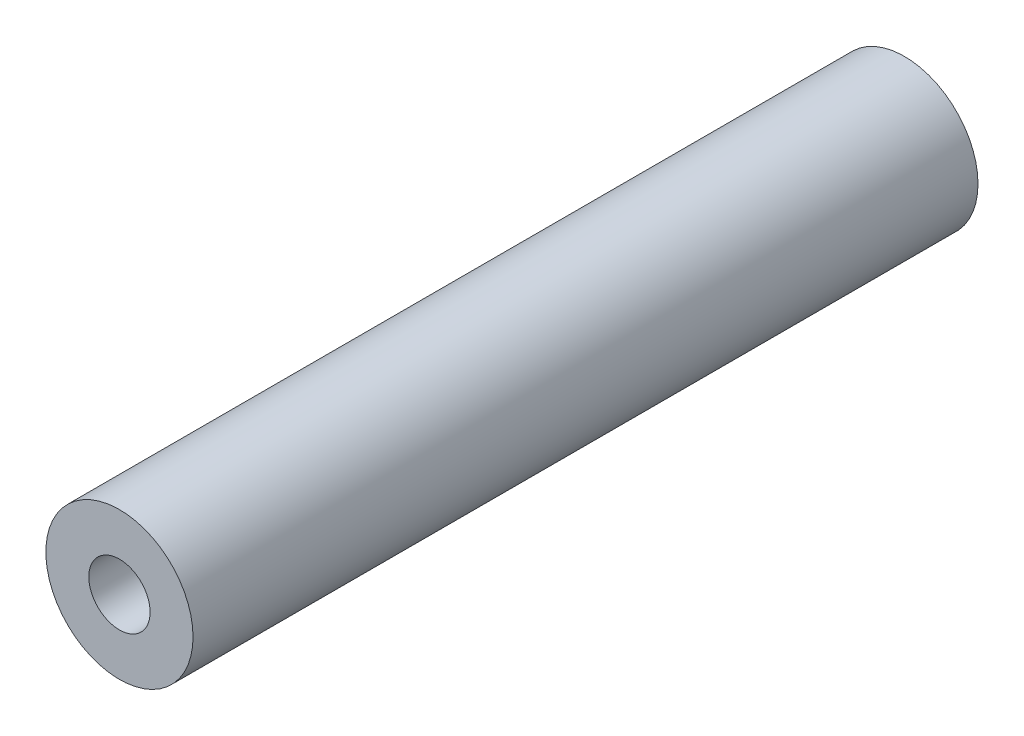
ISO-10303-21;
HEADER;
FILE_DESCRIPTION(('STEP AP214'),'2;1');
FILE_NAME('part.step','',(''),(''),'','','');
FILE_SCHEMA(('AUTOMOTIVE_DESIGN { 1 0 10303 214 1 1 1 1 }'));
ENDSEC;
DATA;
#1=APPLICATION_CONTEXT('core data for automotive mechanical design processes');
#2=APPLICATION_PROTOCOL_DEFINITION('international standard','automotive_design',2000,#1);
#3=PRODUCT_CONTEXT('',#1,'mechanical');
#4=PRODUCT('Part','Part','',(#3));
#5=PRODUCT_RELATED_PRODUCT_CATEGORY('part','',(#4));
#6=PRODUCT_DEFINITION_FORMATION('','',#4);
#7=PRODUCT_DEFINITION_CONTEXT('part definition',#1,'design');
#8=PRODUCT_DEFINITION('design','',#6,#7);
#9=PRODUCT_DEFINITION_SHAPE('','',#8);
#10=(LENGTH_UNIT() NAMED_UNIT(*) SI_UNIT(.MILLI.,.METRE.));
#11=(NAMED_UNIT(*) PLANE_ANGLE_UNIT() SI_UNIT($,.RADIAN.));
#12=(NAMED_UNIT(*) SI_UNIT($,.STERADIAN.) SOLID_ANGLE_UNIT());
#13=UNCERTAINTY_MEASURE_WITH_UNIT(LENGTH_MEASURE(1.E-05),#10,'distance_accuracy_value','');
#14=(GEOMETRIC_REPRESENTATION_CONTEXT(3) GLOBAL_UNCERTAINTY_ASSIGNED_CONTEXT((#13)) GLOBAL_UNIT_ASSIGNED_CONTEXT((#10,
#11,#12)) REPRESENTATION_CONTEXT('',''));
#15=CARTESIAN_POINT('',(0.,0.,0.));
#16=DIRECTION('',(0.,0.,1.));
#17=DIRECTION('',(1.,0.,0.));
#18=AXIS2_PLACEMENT_3D('',#15,#16,#17);
#19=CARTESIAN_POINT('',(0.,0.,32.));
#20=DIRECTION('',(0.,0.,-1.));
#21=DIRECTION('',(-1.,0.,0.));
#22=AXIS2_PLACEMENT_3D('',#19,#20,#21);
#23=CYLINDRICAL_SURFACE('',#22,3.);
#24=CARTESIAN_POINT('',(0.,0.,32.));
#25=DIRECTION('',(0.,0.,1.));
#26=DIRECTION('',(1.,0.,0.));
#27=AXIS2_PLACEMENT_3D('',#24,#25,#26);
#28=CIRCLE('',#27,3.);
#29=CARTESIAN_POINT('',(3.,0.,32.));
#30=VERTEX_POINT('',#29);
#31=EDGE_CURVE('E10',#30,#30,#28,.T.);
#32=ORIENTED_EDGE('',*,*,#31,.F.);
#33=EDGE_LOOP('',(#32));
#34=FACE_BOUND('',#33,.T.);
#35=CARTESIAN_POINT('',(0.,0.,0.));
#36=DIRECTION('',(0.,0.,1.));
#37=DIRECTION('',(1.,0.,0.));
#38=AXIS2_PLACEMENT_3D('',#35,#36,#37);
#39=CIRCLE('',#38,3.);
#40=CARTESIAN_POINT('',(3.,0.,0.));
#41=VERTEX_POINT('',#40);
#42=EDGE_CURVE('E45',#41,#41,#39,.T.);
#43=ORIENTED_EDGE('',*,*,#42,.T.);
#44=EDGE_LOOP('',(#43));
#45=FACE_BOUND('',#44,.T.);
#46=ADVANCED_FACE('F42',(#34,#45),#23,.T.);
#47=CARTESIAN_POINT('',(0.,0.,32.));
#48=DIRECTION('',(0.,0.,1.));
#49=DIRECTION('',(1.,0.,0.));
#50=AXIS2_PLACEMENT_3D('',#47,#48,#49);
#51=PLANE('',#50);
#52=CARTESIAN_POINT('',(0.,0.,32.));
#53=DIRECTION('',(0.,0.,1.));
#54=DIRECTION('',(1.,0.,0.));
#55=AXIS2_PLACEMENT_3D('',#52,#53,#54);
#56=CIRCLE('',#55,1.24999999999999);
#57=CARTESIAN_POINT('',(1.24999999999999,0.,32.));
#58=VERTEX_POINT('',#57);
#59=EDGE_CURVE('E56',#58,#58,#56,.T.);
#60=ORIENTED_EDGE('',*,*,#59,.F.);
#61=EDGE_LOOP('',(#60));
#62=FACE_BOUND('',#61,.T.);
#63=ORIENTED_EDGE('',*,*,#31,.T.);
#64=EDGE_LOOP('',(#63));
#65=FACE_BOUND('',#64,.T.);
#66=ADVANCED_FACE('F62',(#62,#65),#51,.T.);
#67=CARTESIAN_POINT('',(0.,0.,0.));
#68=DIRECTION('',(0.,0.,1.));
#69=DIRECTION('',(1.,0.,0.));
#70=AXIS2_PLACEMENT_3D('',#67,#68,#69);
#71=PLANE('',#70);
#72=CARTESIAN_POINT('',(0.,0.,0.));
#73=DIRECTION('',(0.,0.,1.));
#74=DIRECTION('',(1.,0.,0.));
#75=AXIS2_PLACEMENT_3D('',#72,#73,#74);
#76=CIRCLE('',#75,1.24999999999999);
#77=CARTESIAN_POINT('',(1.24999999999999,0.,0.));
#78=VERTEX_POINT('',#77);
#79=EDGE_CURVE('E52',#78,#78,#76,.T.);
#80=ORIENTED_EDGE('',*,*,#79,.T.);
#81=EDGE_LOOP('',(#80));
#82=FACE_BOUND('',#81,.T.);
#83=ORIENTED_EDGE('',*,*,#42,.F.);
#84=EDGE_LOOP('',(#83));
#85=FACE_BOUND('',#84,.T.);
#86=ADVANCED_FACE('F64',(#82,#85),#71,.F.);
#87=CARTESIAN_POINT('',(0.,0.,32.));
#88=DIRECTION('',(0.,0.,1.));
#89=DIRECTION('',(1.,0.,0.));
#90=AXIS2_PLACEMENT_3D('',#87,#88,#89);
#91=CYLINDRICAL_SURFACE('',#90,1.24999999999999);
#92=ORIENTED_EDGE('',*,*,#79,.F.);
#93=EDGE_LOOP('',(#92));
#94=FACE_BOUND('',#93,.T.);
#95=ORIENTED_EDGE('',*,*,#59,.T.);
#96=EDGE_LOOP('',(#95));
#97=FACE_BOUND('',#96,.T.);
#98=ADVANCED_FACE('F60',(#94,#97),#91,.F.);
#99=CLOSED_SHELL('',(#46,#66,#86,#98));
#100=MANIFOLD_SOLID_BREP('B2',#99);
#101=ADVANCED_BREP_SHAPE_REPRESENTATION('',(#18,#100),#14);
#102=SHAPE_DEFINITION_REPRESENTATION(#9,#101);
ENDSEC;
END-ISO-10303-21;
